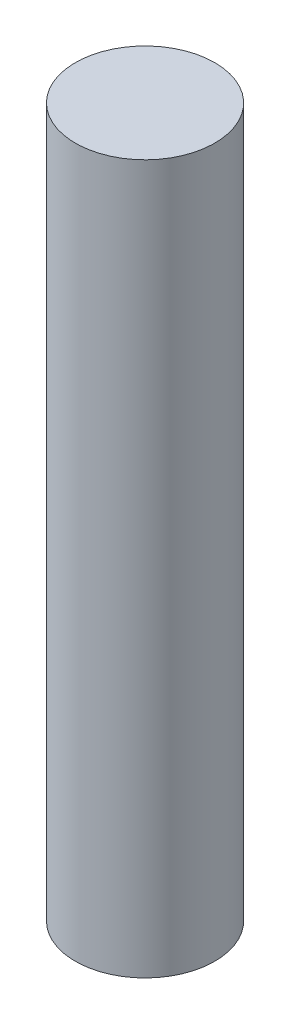
ISO-10303-21;
HEADER;
FILE_DESCRIPTION(('STEP AP214'),'2;1');
FILE_NAME('part.step','',(''),(''),'','','');
FILE_SCHEMA(('AUTOMOTIVE_DESIGN { 1 0 10303 214 1 1 1 1 }'));
ENDSEC;
DATA;
#1=APPLICATION_CONTEXT('core data for automotive mechanical design processes');
#2=APPLICATION_PROTOCOL_DEFINITION('international standard','automotive_design',2000,#1);
#3=PRODUCT_CONTEXT('',#1,'mechanical');
#4=PRODUCT('Part','Part','',(#3));
#5=PRODUCT_RELATED_PRODUCT_CATEGORY('part','',(#4));
#6=PRODUCT_DEFINITION_FORMATION('','',#4);
#7=PRODUCT_DEFINITION_CONTEXT('part definition',#1,'design');
#8=PRODUCT_DEFINITION('design','',#6,#7);
#9=PRODUCT_DEFINITION_SHAPE('','',#8);
#10=(LENGTH_UNIT() NAMED_UNIT(*) SI_UNIT(.MILLI.,.METRE.));
#11=(NAMED_UNIT(*) PLANE_ANGLE_UNIT() SI_UNIT($,.RADIAN.));
#12=(NAMED_UNIT(*) SI_UNIT($,.STERADIAN.) SOLID_ANGLE_UNIT());
#13=UNCERTAINTY_MEASURE_WITH_UNIT(LENGTH_MEASURE(1.E-05),#10,'distance_accuracy_value','');
#14=(GEOMETRIC_REPRESENTATION_CONTEXT(3) GLOBAL_UNCERTAINTY_ASSIGNED_CONTEXT((#13)) GLOBAL_UNIT_ASSIGNED_CONTEXT((#10,
#11,#12)) REPRESENTATION_CONTEXT('',''));
#15=CARTESIAN_POINT('',(0.,0.,0.));
#16=DIRECTION('',(0.,0.,1.));
#17=DIRECTION('',(1.,0.,0.));
#18=AXIS2_PLACEMENT_3D('',#15,#16,#17);
#19=CARTESIAN_POINT('',(0.,-95.758,0.));
#20=DIRECTION('',(0.,1.,0.));
#21=DIRECTION('',(0.,0.,-1.));
#22=AXIS2_PLACEMENT_3D('',#19,#20,#21);
#23=CYLINDRICAL_SURFACE('',#22,3.);
#24=CARTESIAN_POINT('',(0.,-95.758,0.));
#25=DIRECTION('',(0.,-1.,0.));
#26=DIRECTION('',(0.,0.,-1.));
#27=AXIS2_PLACEMENT_3D('',#24,#25,#26);
#28=CIRCLE('',#27,3.);
#29=CARTESIAN_POINT('',(0.,-95.758,-3.));
#30=VERTEX_POINT('',#29);
#31=EDGE_CURVE('E10',#30,#30,#28,.T.);
#32=CARTESIAN_POINT('',(0.,-65.278,0.));
#33=DIRECTION('',(0.,-1.,0.));
#34=DIRECTION('',(0.,0.,-1.));
#35=AXIS2_PLACEMENT_3D('',#32,#33,#34);
#36=CIRCLE('',#35,3.);
#37=CARTESIAN_POINT('',(0.,-65.278,-3.));
#38=VERTEX_POINT('',#37);
#39=EDGE_CURVE('E36',#38,#38,#36,.T.);
#40=CARTESIAN_POINT('',(0.,-95.758,-3.));
#41=CARTESIAN_POINT('',(0.,-95.4405,-3.));
#42=CARTESIAN_POINT('',(0.,-95.123,-3.));
#43=CARTESIAN_POINT('',(0.,-94.488,-3.));
#44=CARTESIAN_POINT('',(0.,-94.1705,-3.));
#45=CARTESIAN_POINT('',(0.,-93.5355,-3.));
#46=CARTESIAN_POINT('',(0.,-93.218,-3.));
#47=CARTESIAN_POINT('',(0.,-92.583,-3.));
#48=CARTESIAN_POINT('',(0.,-92.2655,-3.));
#49=CARTESIAN_POINT('',(0.,-91.6305,-3.));
#50=CARTESIAN_POINT('',(0.,-91.313,-3.));
#51=CARTESIAN_POINT('',(0.,-90.678,-3.));
#52=CARTESIAN_POINT('',(0.,-90.3605,-3.));
#53=CARTESIAN_POINT('',(0.,-89.7255,-3.));
#54=CARTESIAN_POINT('',(0.,-89.408,-3.));
#55=CARTESIAN_POINT('',(0.,-88.773,-3.));
#56=CARTESIAN_POINT('',(0.,-88.4555,-3.));
#57=CARTESIAN_POINT('',(0.,-87.8205,-3.));
#58=CARTESIAN_POINT('',(0.,-87.503,-3.));
#59=CARTESIAN_POINT('',(0.,-86.868,-3.));
#60=CARTESIAN_POINT('',(0.,-86.5505,-3.));
#61=CARTESIAN_POINT('',(0.,-85.9155,-3.));
#62=CARTESIAN_POINT('',(0.,-85.598,-3.));
#63=CARTESIAN_POINT('',(0.,-84.963,-3.));
#64=CARTESIAN_POINT('',(0.,-84.6455,-3.));
#65=CARTESIAN_POINT('',(0.,-84.0105,-3.));
#66=CARTESIAN_POINT('',(0.,-83.693,-3.));
#67=CARTESIAN_POINT('',(0.,-83.058,-3.));
#68=CARTESIAN_POINT('',(0.,-82.7405,-3.));
#69=CARTESIAN_POINT('',(0.,-82.1055,-3.));
#70=CARTESIAN_POINT('',(0.,-81.788,-3.));
#71=CARTESIAN_POINT('',(0.,-81.153,-3.));
#72=CARTESIAN_POINT('',(0.,-80.8355,-3.));
#73=CARTESIAN_POINT('',(0.,-80.2005,-3.));
#74=CARTESIAN_POINT('',(0.,-79.883,-3.));
#75=CARTESIAN_POINT('',(0.,-79.248,-3.));
#76=CARTESIAN_POINT('',(0.,-78.9305,-3.));
#77=CARTESIAN_POINT('',(0.,-78.2955,-3.));
#78=CARTESIAN_POINT('',(0.,-77.978,-3.));
#79=CARTESIAN_POINT('',(0.,-77.343,-3.));
#80=CARTESIAN_POINT('',(0.,-77.0255,-3.));
#81=CARTESIAN_POINT('',(0.,-76.3905,-3.));
#82=CARTESIAN_POINT('',(0.,-76.073,-3.));
#83=CARTESIAN_POINT('',(0.,-75.438,-3.));
#84=CARTESIAN_POINT('',(0.,-75.1205,-3.));
#85=CARTESIAN_POINT('',(0.,-74.4855,-3.));
#86=CARTESIAN_POINT('',(0.,-74.168,-3.));
#87=CARTESIAN_POINT('',(0.,-73.533,-3.));
#88=CARTESIAN_POINT('',(0.,-73.2155,-3.));
#89=CARTESIAN_POINT('',(0.,-72.5805,-3.));
#90=CARTESIAN_POINT('',(0.,-72.263,-3.));
#91=CARTESIAN_POINT('',(0.,-71.628,-3.));
#92=CARTESIAN_POINT('',(0.,-71.3105,-3.));
#93=CARTESIAN_POINT('',(0.,-70.6755,-3.));
#94=CARTESIAN_POINT('',(0.,-70.358,-3.));
#95=CARTESIAN_POINT('',(0.,-69.723,-3.));
#96=CARTESIAN_POINT('',(0.,-69.4055,-3.));
#97=CARTESIAN_POINT('',(0.,-68.7705,-3.));
#98=CARTESIAN_POINT('',(0.,-68.453,-3.));
#99=CARTESIAN_POINT('',(0.,-67.818,-3.));
#100=CARTESIAN_POINT('',(0.,-67.5005,-3.));
#101=CARTESIAN_POINT('',(0.,-66.8655,-3.));
#102=CARTESIAN_POINT('',(0.,-66.548,-3.));
#103=CARTESIAN_POINT('',(0.,-65.913,-3.));
#104=CARTESIAN_POINT('',(0.,-65.5955,-3.));
#105=CARTESIAN_POINT('',(0.,-65.278,-3.));
#106=B_SPLINE_CURVE_WITH_KNOTS('',3,(#40,#41,#42,#43,#44,#45,#46,#47,#48,#49,#50,#51,#52,#53,
#54,#55,#56,#57,#58,#59,#60,#61,#62,#63,#64,#65,#66,#67,#68,#69,#70,#71,#72,#73,#74,#75,#76,#77,
#78,#79,#80,#81,#82,#83,#84,#85,#86,#87,#88,#89,#90,#91,#92,#93,#94,#95,#96,#97,#98,#99,#100,
#101,#102,#103,#104,#105),.UNSPECIFIED.,.F.,.F.,(4,2,2,2,2,2,2,2,2,2,2,2,2,2,2,2,2,2,2,2,2,2,2,
2,2,2,2,2,2,2,2,2,4),(0.,0.952499999999995,1.90499999999999,2.8575,3.80999999999999,
4.76249999999999,5.71499999999998,6.66749999999999,7.61999999999999,8.5725,9.52499999999999,
10.4775,11.43,12.3825,13.335,14.2875,15.24,16.1925,17.145,18.0975,19.05,20.0025,20.955,21.9075,
22.86,23.8125,24.765,25.7175,26.67,27.6225,28.575,29.5275,30.48),.UNSPECIFIED.);
#107=EDGE_CURVE('BSEAM33',#30,#38,#106,.T.);
#108=ORIENTED_EDGE('',*,*,#31,.F.);
#109=ORIENTED_EDGE('',*,*,#39,.T.);
#110=ORIENTED_EDGE('',*,*,#107,.T.);
#111=ORIENTED_EDGE('',*,*,#107,.F.);
#112=EDGE_LOOP('',(#108,#110,#109,#111));
#113=FACE_BOUND('',#112,.T.);
#114=ADVANCED_FACE('F33',(#113),#23,.T.);
#115=CARTESIAN_POINT('',(0.,-95.758,0.));
#116=DIRECTION('',(0.,1.,0.));
#117=DIRECTION('',(0.,0.,-1.));
#118=AXIS2_PLACEMENT_3D('',#115,#116,#117);
#119=PLANE('',#118);
#120=ORIENTED_EDGE('',*,*,#31,.T.);
#121=EDGE_LOOP('',(#120));
#122=FACE_BOUND('',#121,.T.);
#123=ADVANCED_FACE('F48',(#122),#119,.F.);
#124=CARTESIAN_POINT('',(0.,-65.278,0.));
#125=DIRECTION('',(0.,1.,0.));
#126=DIRECTION('',(0.,0.,-1.));
#127=AXIS2_PLACEMENT_3D('',#124,#125,#126);
#128=PLANE('',#127);
#129=ORIENTED_EDGE('',*,*,#39,.F.);
#130=EDGE_LOOP('',(#129));
#131=FACE_BOUND('',#130,.T.);
#132=ADVANCED_FACE('F46',(#131),#128,.T.);
#133=CLOSED_SHELL('',(#114,#123,#132));
#134=MANIFOLD_SOLID_BREP('B2',#133);
#135=ADVANCED_BREP_SHAPE_REPRESENTATION('',(#18,#134),#14);
#136=SHAPE_DEFINITION_REPRESENTATION(#9,#135);
ENDSEC;
END-ISO-10303-21;
